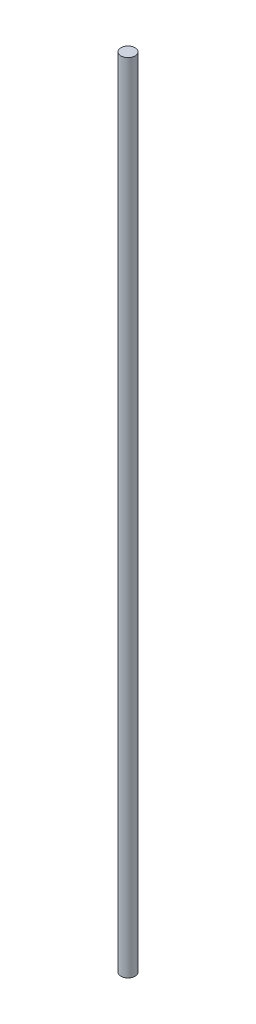
ISO-10303-21;
HEADER;
FILE_DESCRIPTION(('STEP AP214'),'2;1');
FILE_NAME('part.step','',(''),(''),'','','');
FILE_SCHEMA(('AUTOMOTIVE_DESIGN { 1 0 10303 214 1 1 1 1 }'));
ENDSEC;
DATA;
#1=APPLICATION_CONTEXT('core data for automotive mechanical design processes');
#2=APPLICATION_PROTOCOL_DEFINITION('international standard','automotive_design',2000,#1);
#3=PRODUCT_CONTEXT('',#1,'mechanical');
#4=PRODUCT('Part','Part','',(#3));
#5=PRODUCT_RELATED_PRODUCT_CATEGORY('part','',(#4));
#6=PRODUCT_DEFINITION_FORMATION('','',#4);
#7=PRODUCT_DEFINITION_CONTEXT('part definition',#1,'design');
#8=PRODUCT_DEFINITION('design','',#6,#7);
#9=PRODUCT_DEFINITION_SHAPE('','',#8);
#10=(LENGTH_UNIT() NAMED_UNIT(*) SI_UNIT(.MILLI.,.METRE.));
#11=(NAMED_UNIT(*) PLANE_ANGLE_UNIT() SI_UNIT($,.RADIAN.));
#12=(NAMED_UNIT(*) SI_UNIT($,.STERADIAN.) SOLID_ANGLE_UNIT());
#13=UNCERTAINTY_MEASURE_WITH_UNIT(LENGTH_MEASURE(1.E-05),#10,'distance_accuracy_value','');
#14=(GEOMETRIC_REPRESENTATION_CONTEXT(3) GLOBAL_UNCERTAINTY_ASSIGNED_CONTEXT((#13)) GLOBAL_UNIT_ASSIGNED_CONTEXT((#10,
#11,#12)) REPRESENTATION_CONTEXT('',''));
#15=CARTESIAN_POINT('',(0.,0.,0.));
#16=DIRECTION('',(0.,0.,1.));
#17=DIRECTION('',(1.,0.,0.));
#18=AXIS2_PLACEMENT_3D('',#15,#16,#17);
#19=CARTESIAN_POINT('',(0.,-31.0216603999808,0.));
#20=DIRECTION('',(0.,1.,0.));
#21=DIRECTION('',(0.,0.,1.));
#22=AXIS2_PLACEMENT_3D('',#19,#20,#21);
#23=CYLINDRICAL_SURFACE('',#22,2.5);
#24=CARTESIAN_POINT('',(0.,-31.0216603999808,0.));
#25=DIRECTION('',(0.,1.,0.));
#26=DIRECTION('',(0.,0.,1.));
#27=AXIS2_PLACEMENT_3D('',#24,#25,#26);
#28=CIRCLE('',#27,2.5);
#29=CARTESIAN_POINT('',(0.,-31.0216603999808,2.5));
#30=VERTEX_POINT('',#29);
#31=EDGE_CURVE('E10',#30,#30,#28,.T.);
#32=ORIENTED_EDGE('',*,*,#31,.T.);
#33=EDGE_LOOP('',(#32));
#34=FACE_BOUND('',#33,.T.);
#35=CARTESIAN_POINT('',(0.,250.,0.));
#36=DIRECTION('',(0.,1.,0.));
#37=DIRECTION('',(0.,0.,1.));
#38=AXIS2_PLACEMENT_3D('',#35,#36,#37);
#39=CIRCLE('',#38,2.5);
#40=CARTESIAN_POINT('',(0.,250.,2.5));
#41=VERTEX_POINT('',#40);
#42=EDGE_CURVE('E41',#41,#41,#39,.T.);
#43=ORIENTED_EDGE('',*,*,#42,.F.);
#44=EDGE_LOOP('',(#43));
#45=FACE_BOUND('',#44,.T.);
#46=ADVANCED_FACE('F35',(#34,#45),#23,.T.);
#47=CARTESIAN_POINT('',(0.,-31.0216603999808,0.));
#48=DIRECTION('',(0.,1.,0.));
#49=DIRECTION('',(0.,0.,1.));
#50=AXIS2_PLACEMENT_3D('',#47,#48,#49);
#51=PLANE('',#50);
#52=ORIENTED_EDGE('',*,*,#31,.F.);
#53=EDGE_LOOP('',(#52));
#54=FACE_BOUND('',#53,.T.);
#55=ADVANCED_FACE('F50',(#54),#51,.F.);
#56=CARTESIAN_POINT('',(0.,250.,0.));
#57=DIRECTION('',(0.,1.,0.));
#58=DIRECTION('',(0.,0.,1.));
#59=AXIS2_PLACEMENT_3D('',#56,#57,#58);
#60=PLANE('',#59);
#61=ORIENTED_EDGE('',*,*,#42,.T.);
#62=EDGE_LOOP('',(#61));
#63=FACE_BOUND('',#62,.T.);
#64=ADVANCED_FACE('F47',(#63),#60,.T.);
#65=CLOSED_SHELL('',(#46,#55,#64));
#66=MANIFOLD_SOLID_BREP('B2',#65);
#67=ADVANCED_BREP_SHAPE_REPRESENTATION('',(#18,#66),#14);
#68=SHAPE_DEFINITION_REPRESENTATION(#9,#67);
ENDSEC;
END-ISO-10303-21;
